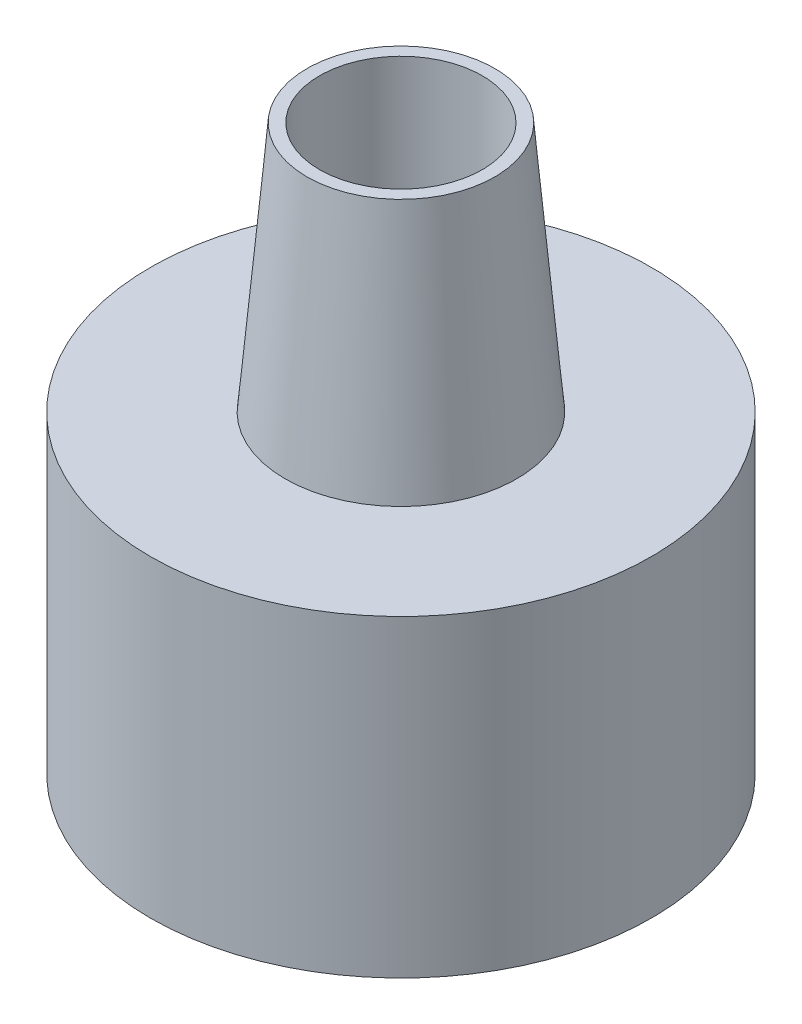
ISO-10303-21;
HEADER;
FILE_DESCRIPTION(('STEP AP214'),'2;1');
FILE_NAME('part.step','',(''),(''),'','','');
FILE_SCHEMA(('AUTOMOTIVE_DESIGN { 1 0 10303 214 1 1 1 1 }'));
ENDSEC;
DATA;
#1=APPLICATION_CONTEXT('core data for automotive mechanical design processes');
#2=APPLICATION_PROTOCOL_DEFINITION('international standard','automotive_design',2000,#1);
#3=PRODUCT_CONTEXT('',#1,'mechanical');
#4=PRODUCT('Part','Part','',(#3));
#5=PRODUCT_RELATED_PRODUCT_CATEGORY('part','',(#4));
#6=PRODUCT_DEFINITION_FORMATION('','',#4);
#7=PRODUCT_DEFINITION_CONTEXT('part definition',#1,'design');
#8=PRODUCT_DEFINITION('design','',#6,#7);
#9=PRODUCT_DEFINITION_SHAPE('','',#8);
#10=(LENGTH_UNIT() NAMED_UNIT(*) SI_UNIT(.MILLI.,.METRE.));
#11=(NAMED_UNIT(*) PLANE_ANGLE_UNIT() SI_UNIT($,.RADIAN.));
#12=(NAMED_UNIT(*) SI_UNIT($,.STERADIAN.) SOLID_ANGLE_UNIT());
#13=UNCERTAINTY_MEASURE_WITH_UNIT(LENGTH_MEASURE(1.E-05),#10,'distance_accuracy_value','');
#14=(GEOMETRIC_REPRESENTATION_CONTEXT(3) GLOBAL_UNCERTAINTY_ASSIGNED_CONTEXT((#13)) GLOBAL_UNIT_ASSIGNED_CONTEXT((#10,
#11,#12)) REPRESENTATION_CONTEXT('',''));
#15=CARTESIAN_POINT('',(0.,0.,0.));
#16=DIRECTION('',(0.,0.,1.));
#17=DIRECTION('',(1.,0.,0.));
#18=AXIS2_PLACEMENT_3D('',#15,#16,#17);
#19=CARTESIAN_POINT('',(0.,3.75,6.));
#20=DIRECTION('',(0.,-1.,0.));
#21=DIRECTION('',(0.,0.,-1.));
#22=AXIS2_PLACEMENT_3D('',#19,#20,#21);
#23=PLANE('',#22);
#24=CARTESIAN_POINT('',(0.,3.75,0.));
#25=DIRECTION('',(0.,1.,0.));
#26=DIRECTION('',(0.,0.,1.));
#27=AXIS2_PLACEMENT_3D('',#24,#25,#26);
#28=CIRCLE('',#27,3.25);
#29=CARTESIAN_POINT('',(0.,3.75,3.25));
#30=VERTEX_POINT('',#29);
#31=EDGE_CURVE('E10',#30,#30,#28,.T.);
#32=ORIENTED_EDGE('',*,*,#31,.T.);
#33=EDGE_LOOP('',(#32));
#34=FACE_BOUND('',#33,.T.);
#35=CARTESIAN_POINT('',(0.,3.75,0.));
#36=DIRECTION('',(0.,1.,0.));
#37=DIRECTION('',(0.,0.,1.));
#38=AXIS2_PLACEMENT_3D('',#35,#36,#37);
#39=CIRCLE('',#38,6.);
#40=CARTESIAN_POINT('',(0.,3.75,6.));
#41=VERTEX_POINT('',#40);
#42=EDGE_CURVE('E62',#41,#41,#39,.T.);
#43=ORIENTED_EDGE('',*,*,#42,.F.);
#44=EDGE_LOOP('',(#43));
#45=FACE_BOUND('',#44,.T.);
#46=ADVANCED_FACE('F31',(#34,#45),#23,.T.);
#47=CARTESIAN_POINT('',(0.,15.0909090909091,0.));
#48=DIRECTION('',(0.,1.,0.));
#49=DIRECTION('',(0.,0.,1.));
#50=AXIS2_PLACEMENT_3D('',#47,#48,#49);
#51=CYLINDRICAL_SURFACE('',#50,3.25);
#52=CARTESIAN_POINT('',(0.,16.25,0.));
#53=DIRECTION('',(0.,1.,0.));
#54=DIRECTION('',(0.,0.,1.));
#55=AXIS2_PLACEMENT_3D('',#52,#53,#54);
#56=CIRCLE('',#55,3.25);
#57=CARTESIAN_POINT('',(0.,16.25,3.25));
#58=VERTEX_POINT('',#57);
#59=EDGE_CURVE('E37',#58,#58,#56,.T.);
#60=ORIENTED_EDGE('',*,*,#59,.T.);
#61=EDGE_LOOP('',(#60));
#62=FACE_BOUND('',#61,.T.);
#63=ORIENTED_EDGE('',*,*,#31,.F.);
#64=EDGE_LOOP('',(#63));
#65=FACE_BOUND('',#64,.T.);
#66=ADVANCED_FACE('F70',(#62,#65),#51,.F.);
#67=CARTESIAN_POINT('',(0.,16.25,3.75));
#68=DIRECTION('',(0.,1.,0.));
#69=DIRECTION('',(0.,0.,1.));
#70=AXIS2_PLACEMENT_3D('',#67,#68,#69);
#71=PLANE('',#70);
#72=CARTESIAN_POINT('',(0.,16.25,0.));
#73=DIRECTION('',(0.,1.,0.));
#74=DIRECTION('',(0.,0.,1.));
#75=AXIS2_PLACEMENT_3D('',#72,#73,#74);
#76=CIRCLE('',#75,3.75);
#77=CARTESIAN_POINT('',(0.,16.25,3.75));
#78=VERTEX_POINT('',#77);
#79=EDGE_CURVE('E41',#78,#78,#76,.T.);
#80=ORIENTED_EDGE('',*,*,#79,.T.);
#81=EDGE_LOOP('',(#80));
#82=FACE_BOUND('',#81,.T.);
#83=ORIENTED_EDGE('',*,*,#59,.F.);
#84=EDGE_LOOP('',(#83));
#85=FACE_BOUND('',#84,.T.);
#86=ADVANCED_FACE('F74',(#82,#85),#71,.T.);
#87=CARTESIAN_POINT('',(0.,16.25,0.));
#88=DIRECTION('',(0.,-1.,0.));
#89=DIRECTION('',(0.,0.,-1.));
#90=AXIS2_PLACEMENT_3D('',#87,#88,#89);
#91=CONICAL_SURFACE('',#90,3.75,0.0872664625997201);
#92=CARTESIAN_POINT('',(0.,6.25,0.));
#93=DIRECTION('',(0.,1.,0.));
#94=DIRECTION('',(0.,0.,1.));
#95=AXIS2_PLACEMENT_3D('',#92,#93,#94);
#96=CIRCLE('',#95,4.62488663525927);
#97=CARTESIAN_POINT('',(0.,6.25,4.62488663525927));
#98=VERTEX_POINT('',#97);
#99=EDGE_CURVE('E45',#98,#98,#96,.T.);
#100=ORIENTED_EDGE('',*,*,#99,.T.);
#101=EDGE_LOOP('',(#100));
#102=FACE_BOUND('',#101,.T.);
#103=ORIENTED_EDGE('',*,*,#79,.F.);
#104=EDGE_LOOP('',(#103));
#105=FACE_BOUND('',#104,.T.);
#106=ADVANCED_FACE('F78',(#102,#105),#91,.T.);
#107=CARTESIAN_POINT('',(0.,6.25,10.));
#108=DIRECTION('',(0.,1.,0.));
#109=DIRECTION('',(0.,0.,1.));
#110=AXIS2_PLACEMENT_3D('',#107,#108,#109);
#111=PLANE('',#110);
#112=CARTESIAN_POINT('',(0.,6.25,0.));
#113=DIRECTION('',(0.,1.,0.));
#114=DIRECTION('',(0.,0.,1.));
#115=AXIS2_PLACEMENT_3D('',#112,#113,#114);
#116=CIRCLE('',#115,10.);
#117=CARTESIAN_POINT('',(0.,6.25,10.));
#118=VERTEX_POINT('',#117);
#119=EDGE_CURVE('E50',#118,#118,#116,.T.);
#120=ORIENTED_EDGE('',*,*,#119,.T.);
#121=EDGE_LOOP('',(#120));
#122=FACE_BOUND('',#121,.T.);
#123=ORIENTED_EDGE('',*,*,#99,.F.);
#124=EDGE_LOOP('',(#123));
#125=FACE_BOUND('',#124,.T.);
#126=ADVANCED_FACE('F85',(#122,#125),#111,.T.);
#127=CARTESIAN_POINT('',(0.,15.0909090909091,0.));
#128=DIRECTION('',(0.,1.,0.));
#129=DIRECTION('',(0.,0.,1.));
#130=AXIS2_PLACEMENT_3D('',#127,#128,#129);
#131=CYLINDRICAL_SURFACE('',#130,10.);
#132=CARTESIAN_POINT('',(0.,-6.25,0.));
#133=DIRECTION('',(0.,1.,0.));
#134=DIRECTION('',(0.,0.,1.));
#135=AXIS2_PLACEMENT_3D('',#132,#133,#134);
#136=CIRCLE('',#135,10.);
#137=CARTESIAN_POINT('',(0.,-6.25,10.));
#138=VERTEX_POINT('',#137);
#139=EDGE_CURVE('E53',#138,#138,#136,.T.);
#140=ORIENTED_EDGE('',*,*,#139,.T.);
#141=EDGE_LOOP('',(#140));
#142=FACE_BOUND('',#141,.T.);
#143=ORIENTED_EDGE('',*,*,#119,.F.);
#144=EDGE_LOOP('',(#143));
#145=FACE_BOUND('',#144,.T.);
#146=ADVANCED_FACE('F89',(#142,#145),#131,.T.);
#147=CARTESIAN_POINT('',(0.,-6.25,8.));
#148=DIRECTION('',(0.,-1.,0.));
#149=DIRECTION('',(0.,0.,-1.));
#150=AXIS2_PLACEMENT_3D('',#147,#148,#149);
#151=PLANE('',#150);
#152=CARTESIAN_POINT('',(0.,-6.25,0.));
#153=DIRECTION('',(0.,1.,0.));
#154=DIRECTION('',(0.,0.,1.));
#155=AXIS2_PLACEMENT_3D('',#152,#153,#154);
#156=CIRCLE('',#155,8.);
#157=CARTESIAN_POINT('',(0.,-6.25,8.));
#158=VERTEX_POINT('',#157);
#159=EDGE_CURVE('E56',#158,#158,#156,.T.);
#160=ORIENTED_EDGE('',*,*,#159,.T.);
#161=EDGE_LOOP('',(#160));
#162=FACE_BOUND('',#161,.T.);
#163=ORIENTED_EDGE('',*,*,#139,.F.);
#164=EDGE_LOOP('',(#163));
#165=FACE_BOUND('',#164,.T.);
#166=ADVANCED_FACE('F93',(#162,#165),#151,.T.);
#167=CARTESIAN_POINT('',(0.,-6.25,0.));
#168=DIRECTION('',(0.,-1.,0.));
#169=DIRECTION('',(0.,0.,-1.));
#170=AXIS2_PLACEMENT_3D('',#167,#168,#169);
#171=CONICAL_SURFACE('',#170,8.,0.785398163397449);
#172=CARTESIAN_POINT('',(0.,-4.25,0.));
#173=DIRECTION('',(0.,1.,0.));
#174=DIRECTION('',(0.,0.,1.));
#175=AXIS2_PLACEMENT_3D('',#172,#173,#174);
#176=CIRCLE('',#175,6.);
#177=CARTESIAN_POINT('',(0.,-4.25,6.));
#178=VERTEX_POINT('',#177);
#179=EDGE_CURVE('E59',#178,#178,#176,.T.);
#180=ORIENTED_EDGE('',*,*,#179,.T.);
#181=EDGE_LOOP('',(#180));
#182=FACE_BOUND('',#181,.T.);
#183=ORIENTED_EDGE('',*,*,#159,.F.);
#184=EDGE_LOOP('',(#183));
#185=FACE_BOUND('',#184,.T.);
#186=ADVANCED_FACE('F97',(#182,#185),#171,.F.);
#187=CARTESIAN_POINT('',(0.,15.0909090909091,0.));
#188=DIRECTION('',(0.,1.,0.));
#189=DIRECTION('',(0.,0.,1.));
#190=AXIS2_PLACEMENT_3D('',#187,#188,#189);
#191=CYLINDRICAL_SURFACE('',#190,6.);
#192=ORIENTED_EDGE('',*,*,#42,.T.);
#193=EDGE_LOOP('',(#192));
#194=FACE_BOUND('',#193,.T.);
#195=ORIENTED_EDGE('',*,*,#179,.F.);
#196=EDGE_LOOP('',(#195));
#197=FACE_BOUND('',#196,.T.);
#198=ADVANCED_FACE('F66',(#194,#197),#191,.F.);
#199=CLOSED_SHELL('',(#46,#66,#86,#106,#126,#146,#166,#186,#198));
#200=MANIFOLD_SOLID_BREP('B2',#199);
#201=ADVANCED_BREP_SHAPE_REPRESENTATION('',(#18,#200),#14);
#202=SHAPE_DEFINITION_REPRESENTATION(#9,#201);
ENDSEC;
END-ISO-10303-21;
